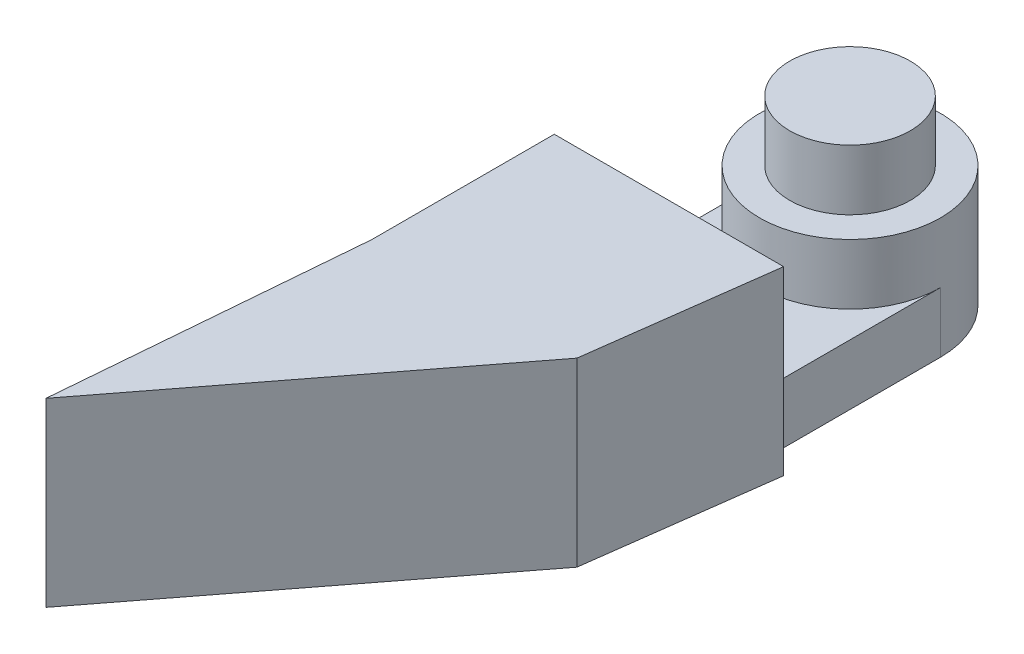
ISO-10303-21;
HEADER;
FILE_DESCRIPTION(('STEP AP214'),'2;1');
FILE_NAME('part.step','',(''),(''),'','','');
FILE_SCHEMA(('AUTOMOTIVE_DESIGN { 1 0 10303 214 1 1 1 1 }'));
ENDSEC;
DATA;
#1=APPLICATION_CONTEXT('core data for automotive mechanical design processes');
#2=APPLICATION_PROTOCOL_DEFINITION('international standard','automotive_design',2000,#1);
#3=PRODUCT_CONTEXT('',#1,'mechanical');
#4=PRODUCT('Part','Part','',(#3));
#5=PRODUCT_RELATED_PRODUCT_CATEGORY('part','',(#4));
#6=PRODUCT_DEFINITION_FORMATION('','',#4);
#7=PRODUCT_DEFINITION_CONTEXT('part definition',#1,'design');
#8=PRODUCT_DEFINITION('design','',#6,#7);
#9=PRODUCT_DEFINITION_SHAPE('','',#8);
#10=(LENGTH_UNIT() NAMED_UNIT(*) SI_UNIT(.MILLI.,.METRE.));
#11=(NAMED_UNIT(*) PLANE_ANGLE_UNIT() SI_UNIT($,.RADIAN.));
#12=(NAMED_UNIT(*) SI_UNIT($,.STERADIAN.) SOLID_ANGLE_UNIT());
#13=UNCERTAINTY_MEASURE_WITH_UNIT(LENGTH_MEASURE(1.E-05),#10,'distance_accuracy_value','');
#14=(GEOMETRIC_REPRESENTATION_CONTEXT(3) GLOBAL_UNCERTAINTY_ASSIGNED_CONTEXT((#13)) GLOBAL_UNIT_ASSIGNED_CONTEXT((#10,
#11,#12)) REPRESENTATION_CONTEXT('',''));
#15=CARTESIAN_POINT('',(0.,0.,0.));
#16=DIRECTION('',(0.,0.,1.));
#17=DIRECTION('',(1.,0.,0.));
#18=AXIS2_PLACEMENT_3D('',#15,#16,#17);
#19=CARTESIAN_POINT('',(98.9290186333893,15.,0.));
#20=DIRECTION('',(0.,-1.,0.));
#21=DIRECTION('',(0.,0.,-1.));
#22=AXIS2_PLACEMENT_3D('',#19,#20,#21);
#23=CYLINDRICAL_SURFACE('',#22,5.);
#24=CARTESIAN_POINT('',(98.9290186333893,10.,0.));
#25=DIRECTION('',(0.,1.,0.));
#26=DIRECTION('',(0.,0.,1.));
#27=AXIS2_PLACEMENT_3D('',#24,#25,#26);
#28=CIRCLE('',#27,5.);
#29=CARTESIAN_POINT('',(98.9290186333893,10.,5.));
#30=VERTEX_POINT('',#29);
#31=EDGE_CURVE('E11',#30,#30,#28,.F.);
#32=ORIENTED_EDGE('',*,*,#31,.F.);
#33=EDGE_LOOP('',(#32));
#34=FACE_BOUND('',#33,.T.);
#35=CARTESIAN_POINT('',(98.9290186333893,15.,0.));
#36=DIRECTION('',(0.,1.,0.));
#37=DIRECTION('',(0.,0.,1.));
#38=AXIS2_PLACEMENT_3D('',#35,#36,#37);
#39=CIRCLE('',#38,5.);
#40=CARTESIAN_POINT('',(98.9290186333893,15.,5.));
#41=VERTEX_POINT('',#40);
#42=EDGE_CURVE('E42',#41,#41,#39,.F.);
#43=ORIENTED_EDGE('',*,*,#42,.T.);
#44=EDGE_LOOP('',(#43));
#45=FACE_BOUND('',#44,.T.);
#46=ADVANCED_FACE('F35',(#34,#45),#23,.T.);
#47=CARTESIAN_POINT('',(0.,15.,0.));
#48=DIRECTION('',(0.,1.,0.));
#49=DIRECTION('',(0.,0.,1.));
#50=AXIS2_PLACEMENT_3D('',#47,#48,#49);
#51=PLANE('',#50);
#52=ORIENTED_EDGE('',*,*,#42,.F.);
#53=EDGE_LOOP('',(#52));
#54=FACE_BOUND('',#53,.T.);
#55=ADVANCED_FACE('F190',(#54),#51,.T.);
#56=CARTESIAN_POINT('',(98.9290186333893,10.,0.));
#57=DIRECTION('',(0.,-1.,0.));
#58=DIRECTION('',(0.,0.,-1.));
#59=AXIS2_PLACEMENT_3D('',#56,#57,#58);
#60=CYLINDRICAL_SURFACE('',#59,7.5);
#61=DIRECTION('',(0.,-1.,0.));
#62=VECTOR('',#61,1.);
#63=CARTESIAN_POINT('',(106.429018633389,5.,0.));
#64=LINE('',#63,#62);
#65=CARTESIAN_POINT('',(106.429018633389,5.,0.));
#66=VERTEX_POINT('',#65);
#67=CARTESIAN_POINT('',(106.429018633389,0.,0.));
#68=VERTEX_POINT('',#67);
#69=EDGE_CURVE('E75',#66,#68,#64,.T.);
#70=ORIENTED_EDGE('',*,*,#69,.T.);
#71=CARTESIAN_POINT('',(98.9290186333893,0.,0.));
#72=DIRECTION('',(0.,1.,0.));
#73=DIRECTION('',(0.,0.,1.));
#74=AXIS2_PLACEMENT_3D('',#71,#72,#73);
#75=CIRCLE('',#74,7.5);
#76=CARTESIAN_POINT('',(91.4290186333893,0.,0.));
#77=VERTEX_POINT('',#76);
#78=EDGE_CURVE('E182',#77,#68,#75,.F.);
#79=ORIENTED_EDGE('',*,*,#78,.F.);
#80=DIRECTION('',(0.,-1.,0.));
#81=VECTOR('',#80,1.);
#82=CARTESIAN_POINT('',(91.4290186333893,5.,0.));
#83=LINE('',#82,#81);
#84=CARTESIAN_POINT('',(91.4290186333893,5.,0.));
#85=VERTEX_POINT('',#84);
#86=EDGE_CURVE('E179',#85,#77,#83,.T.);
#87=ORIENTED_EDGE('',*,*,#86,.F.);
#88=CARTESIAN_POINT('',(98.9290186333893,5.,0.));
#89=DIRECTION('',(0.,1.,0.));
#90=DIRECTION('',(0.,0.,1.));
#91=AXIS2_PLACEMENT_3D('',#88,#89,#90);
#92=CIRCLE('',#91,7.5);
#93=EDGE_CURVE('E166',#66,#85,#92,.F.);
#94=ORIENTED_EDGE('',*,*,#93,.F.);
#95=EDGE_LOOP('',(#70,#79,#87,#94));
#96=FACE_BOUND('',#95,.T.);
#97=CARTESIAN_POINT('',(98.9290186333893,10.,0.));
#98=DIRECTION('',(0.,1.,0.));
#99=DIRECTION('',(0.,0.,1.));
#100=AXIS2_PLACEMENT_3D('',#97,#98,#99);
#101=CIRCLE('',#100,7.5);
#102=CARTESIAN_POINT('',(98.9290186333893,10.,7.5));
#103=VERTEX_POINT('',#102);
#104=EDGE_CURVE('E183',#103,#103,#101,.F.);
#105=ORIENTED_EDGE('',*,*,#104,.T.);
#106=EDGE_LOOP('',(#105));
#107=FACE_BOUND('',#106,.T.);
#108=ADVANCED_FACE('F192',(#96,#107),#60,.T.);
#109=CARTESIAN_POINT('',(0.,10.,0.));
#110=DIRECTION('',(0.,1.,0.));
#111=DIRECTION('',(0.,0.,1.));
#112=AXIS2_PLACEMENT_3D('',#109,#110,#111);
#113=PLANE('',#112);
#114=ORIENTED_EDGE('',*,*,#31,.T.);
#115=EDGE_LOOP('',(#114));
#116=FACE_BOUND('',#115,.T.);
#117=ORIENTED_EDGE('',*,*,#104,.F.);
#118=EDGE_LOOP('',(#117));
#119=FACE_BOUND('',#118,.T.);
#120=ADVANCED_FACE('F198',(#116,#119),#113,.T.);
#121=CARTESIAN_POINT('',(0.,0.,0.));
#122=DIRECTION('',(0.,1.,0.));
#123=DIRECTION('',(0.,0.,1.));
#124=AXIS2_PLACEMENT_3D('',#121,#122,#123);
#125=PLANE('',#124);
#126=ORIENTED_EDGE('',*,*,#78,.T.);
#127=DIRECTION('',(0.,0.,1.));
#128=VECTOR('',#127,1.);
#129=CARTESIAN_POINT('',(106.429018633389,0.,0.));
#130=LINE('',#129,#128);
#131=CARTESIAN_POINT('',(106.429018633389,0.,15.));
#132=VERTEX_POINT('',#131);
#133=EDGE_CURVE('E122',#68,#132,#130,.T.);
#134=ORIENTED_EDGE('',*,*,#133,.T.);
#135=DIRECTION('',(1.,0.,0.));
#136=VECTOR('',#135,1.);
#137=CARTESIAN_POINT('',(0.,0.,15.));
#138=LINE('',#137,#136);
#139=CARTESIAN_POINT('',(108.429018633389,0.,15.));
#140=VERTEX_POINT('',#139);
#141=EDGE_CURVE('E148',#132,#140,#138,.T.);
#142=ORIENTED_EDGE('',*,*,#141,.T.);
#143=DIRECTION('',(-0.131071920752448,0.,0.991372862040445));
#144=VECTOR('',#143,1.);
#145=CARTESIAN_POINT('',(108.515341708194,0.,14.3470885813101));
#146=LINE('',#145,#144);
#147=CARTESIAN_POINT('',(106.429018633389,0.,30.1271585302061));
#148=VERTEX_POINT('',#147);
#149=EDGE_CURVE('E118',#140,#148,#146,.T.);
#150=ORIENTED_EDGE('',*,*,#149,.T.);
#151=DIRECTION('',(-0.609198044114665,0.,0.793018122773286));
#152=VECTOR('',#151,1.);
#153=CARTESIAN_POINT('',(81.4854246461835,0.,62.5972596246702));
#154=LINE('',#153,#152);
#155=CARTESIAN_POINT('',(87.3216540728135,0.,55.));
#156=VERTEX_POINT('',#155);
#157=EDGE_CURVE('E134',#148,#156,#154,.T.);
#158=ORIENTED_EDGE('',*,*,#157,.T.);
#159=DIRECTION('',(0.0844230553486425,0.,-0.996430001417862));
#160=VECTOR('',#159,1.);
#161=CARTESIAN_POINT('',(91.3259821990599,0.,7.73764182028789));
#162=LINE('',#161,#160);
#163=CARTESIAN_POINT('',(89.4290186333893,0.,30.1271585302061));
#164=VERTEX_POINT('',#163);
#165=EDGE_CURVE('E154',#156,#164,#162,.T.);
#166=ORIENTED_EDGE('',*,*,#165,.T.);
#167=DIRECTION('',(0.,0.,-1.));
#168=VECTOR('',#167,1.);
#169=CARTESIAN_POINT('',(89.4290186333893,0.,0.));
#170=LINE('',#169,#168);
#171=CARTESIAN_POINT('',(89.4290186333893,0.,15.));
#172=VERTEX_POINT('',#171);
#173=EDGE_CURVE('E151',#164,#172,#170,.T.);
#174=ORIENTED_EDGE('',*,*,#173,.T.);
#175=CARTESIAN_POINT('',(91.4290186333893,0.,15.));
#176=VERTEX_POINT('',#175);
#177=EDGE_CURVE('E149',#172,#176,#138,.T.);
#178=ORIENTED_EDGE('',*,*,#177,.T.);
#179=DIRECTION('',(0.,0.,1.));
#180=VECTOR('',#179,1.);
#181=CARTESIAN_POINT('',(91.4290186333893,0.,0.));
#182=LINE('',#181,#180);
#183=EDGE_CURVE('E49',#77,#176,#182,.T.);
#184=ORIENTED_EDGE('',*,*,#183,.F.);
#185=EDGE_LOOP('',(#126,#134,#142,#150,#158,#166,#174,#178,#184));
#186=FACE_BOUND('',#185,.T.);
#187=ADVANCED_FACE('F203',(#186),#125,.F.);
#188=CARTESIAN_POINT('',(106.429018633389,5.,0.));
#189=DIRECTION('',(1.,0.,0.));
#190=DIRECTION('',(0.,0.,-1.));
#191=AXIS2_PLACEMENT_3D('',#188,#189,#190);
#192=PLANE('',#191);
#193=ORIENTED_EDGE('',*,*,#133,.F.);
#194=ORIENTED_EDGE('',*,*,#69,.F.);
#195=DIRECTION('',(0.,0.,1.));
#196=VECTOR('',#195,1.);
#197=CARTESIAN_POINT('',(106.429018633389,5.,0.));
#198=LINE('',#197,#196);
#199=CARTESIAN_POINT('',(106.429018633389,5.,15.));
#200=VERTEX_POINT('',#199);
#201=EDGE_CURVE('E58',#66,#200,#198,.T.);
#202=ORIENTED_EDGE('',*,*,#201,.T.);
#203=DIRECTION('',(0.,-1.,0.));
#204=VECTOR('',#203,1.);
#205=CARTESIAN_POINT('',(106.429018633389,5.,15.));
#206=LINE('',#205,#204);
#207=EDGE_CURVE('E71',#200,#132,#206,.T.);
#208=ORIENTED_EDGE('',*,*,#207,.T.);
#209=EDGE_LOOP('',(#193,#194,#202,#208));
#210=FACE_BOUND('',#209,.T.);
#211=ADVANCED_FACE('F205',(#210),#192,.T.);
#212=CARTESIAN_POINT('',(91.4290186333893,5.,0.));
#213=DIRECTION('',(1.,0.,0.));
#214=DIRECTION('',(0.,0.,-1.));
#215=AXIS2_PLACEMENT_3D('',#212,#213,#214);
#216=PLANE('',#215);
#217=ORIENTED_EDGE('',*,*,#183,.T.);
#218=DIRECTION('',(0.,-1.,0.));
#219=VECTOR('',#218,1.);
#220=CARTESIAN_POINT('',(91.4290186333893,5.,15.));
#221=LINE('',#220,#219);
#222=CARTESIAN_POINT('',(91.4290186333893,5.,15.));
#223=VERTEX_POINT('',#222);
#224=EDGE_CURVE('E176',#223,#176,#221,.T.);
#225=ORIENTED_EDGE('',*,*,#224,.F.);
#226=DIRECTION('',(0.,0.,1.));
#227=VECTOR('',#226,1.);
#228=CARTESIAN_POINT('',(91.4290186333893,5.,0.));
#229=LINE('',#228,#227);
#230=EDGE_CURVE('E168',#85,#223,#229,.T.);
#231=ORIENTED_EDGE('',*,*,#230,.F.);
#232=ORIENTED_EDGE('',*,*,#86,.T.);
#233=EDGE_LOOP('',(#217,#225,#231,#232));
#234=FACE_BOUND('',#233,.T.);
#235=ADVANCED_FACE('F210',(#234),#216,.F.);
#236=CARTESIAN_POINT('',(0.,5.,0.));
#237=DIRECTION('',(0.,1.,0.));
#238=DIRECTION('',(0.,0.,1.));
#239=AXIS2_PLACEMENT_3D('',#236,#237,#238);
#240=PLANE('',#239);
#241=ORIENTED_EDGE('',*,*,#201,.F.);
#242=ORIENTED_EDGE('',*,*,#93,.T.);
#243=ORIENTED_EDGE('',*,*,#230,.T.);
#244=DIRECTION('',(-1.,0.,0.));
#245=VECTOR('',#244,1.);
#246=CARTESIAN_POINT('',(0.,5.,15.));
#247=LINE('',#246,#245);
#248=EDGE_CURVE('E170',#200,#223,#247,.T.);
#249=ORIENTED_EDGE('',*,*,#248,.F.);
#250=EDGE_LOOP('',(#241,#242,#243,#249));
#251=FACE_BOUND('',#250,.T.);
#252=ADVANCED_FACE('F219',(#251),#240,.T.);
#253=CARTESIAN_POINT('',(0.,15.,15.));
#254=DIRECTION('',(0.,0.,-1.));
#255=DIRECTION('',(-1.,0.,0.));
#256=AXIS2_PLACEMENT_3D('',#253,#254,#255);
#257=PLANE('',#256);
#258=ORIENTED_EDGE('',*,*,#207,.F.);
#259=ORIENTED_EDGE('',*,*,#248,.T.);
#260=ORIENTED_EDGE('',*,*,#224,.T.);
#261=ORIENTED_EDGE('',*,*,#177,.F.);
#262=DIRECTION('',(0.,-1.,0.));
#263=VECTOR('',#262,1.);
#264=CARTESIAN_POINT('',(89.4290186333893,15.,15.));
#265=LINE('',#264,#263);
#266=CARTESIAN_POINT('',(89.4290186333893,15.,15.));
#267=VERTEX_POINT('',#266);
#268=EDGE_CURVE('E123',#267,#172,#265,.T.);
#269=ORIENTED_EDGE('',*,*,#268,.F.);
#270=DIRECTION('',(1.,0.,0.));
#271=VECTOR('',#270,1.);
#272=CARTESIAN_POINT('',(0.,15.,15.));
#273=LINE('',#272,#271);
#274=CARTESIAN_POINT('',(108.429018633389,15.,15.));
#275=VERTEX_POINT('',#274);
#276=EDGE_CURVE('E129',#267,#275,#273,.T.);
#277=ORIENTED_EDGE('',*,*,#276,.T.);
#278=DIRECTION('',(0.,-1.,0.));
#279=VECTOR('',#278,1.);
#280=CARTESIAN_POINT('',(108.429018633389,15.,15.));
#281=LINE('',#280,#279);
#282=EDGE_CURVE('E112',#275,#140,#281,.T.);
#283=ORIENTED_EDGE('',*,*,#282,.T.);
#284=ORIENTED_EDGE('',*,*,#141,.F.);
#285=EDGE_LOOP('',(#258,#259,#260,#261,#269,#277,#283,#284));
#286=FACE_BOUND('',#285,.T.);
#287=ADVANCED_FACE('F136',(#286),#257,.T.);
#288=CARTESIAN_POINT('',(108.515341708194,15.,14.3470885813101));
#289=DIRECTION('',(0.991372862040445,0.,0.131071920752448));
#290=DIRECTION('',(0.131071920752448,0.,-0.991372862040445));
#291=AXIS2_PLACEMENT_3D('',#288,#289,#290);
#292=PLANE('',#291);
#293=ORIENTED_EDGE('',*,*,#149,.F.);
#294=ORIENTED_EDGE('',*,*,#282,.F.);
#295=DIRECTION('',(-0.131071920752448,0.,0.991372862040445));
#296=VECTOR('',#295,1.);
#297=CARTESIAN_POINT('',(108.515341708194,15.,14.3470885813101));
#298=LINE('',#297,#296);
#299=CARTESIAN_POINT('',(106.429018633389,15.,30.1271585302061));
#300=VERTEX_POINT('',#299);
#301=EDGE_CURVE('E115',#275,#300,#298,.T.);
#302=ORIENTED_EDGE('',*,*,#301,.T.);
#303=DIRECTION('',(0.,-1.,0.));
#304=VECTOR('',#303,1.);
#305=CARTESIAN_POINT('',(106.429018633389,15.,30.1271585302061));
#306=LINE('',#305,#304);
#307=EDGE_CURVE('E146',#300,#148,#306,.T.);
#308=ORIENTED_EDGE('',*,*,#307,.T.);
#309=EDGE_LOOP('',(#293,#294,#302,#308));
#310=FACE_BOUND('',#309,.T.);
#311=ADVANCED_FACE('F114',(#310),#292,.T.);
#312=CARTESIAN_POINT('',(89.4290186333893,15.,0.));
#313=DIRECTION('',(-1.,0.,0.));
#314=DIRECTION('',(0.,0.,1.));
#315=AXIS2_PLACEMENT_3D('',#312,#313,#314);
#316=PLANE('',#315);
#317=ORIENTED_EDGE('',*,*,#173,.F.);
#318=DIRECTION('',(0.,-1.,0.));
#319=VECTOR('',#318,1.);
#320=CARTESIAN_POINT('',(89.4290186333893,15.,30.1271585302061));
#321=LINE('',#320,#319);
#322=CARTESIAN_POINT('',(89.4290186333893,15.,30.1271585302061));
#323=VERTEX_POINT('',#322);
#324=EDGE_CURVE('E162',#323,#164,#321,.T.);
#325=ORIENTED_EDGE('',*,*,#324,.F.);
#326=DIRECTION('',(0.,0.,-1.));
#327=VECTOR('',#326,1.);
#328=CARTESIAN_POINT('',(89.4290186333893,15.,0.));
#329=LINE('',#328,#327);
#330=EDGE_CURVE('E138',#323,#267,#329,.T.);
#331=ORIENTED_EDGE('',*,*,#330,.T.);
#332=ORIENTED_EDGE('',*,*,#268,.T.);
#333=EDGE_LOOP('',(#317,#325,#331,#332));
#334=FACE_BOUND('',#333,.T.);
#335=ADVANCED_FACE('F230',(#334),#316,.T.);
#336=CARTESIAN_POINT('',(91.3259821990599,15.,7.73764182028789));
#337=DIRECTION('',(-0.996430001417862,0.,-0.0844230553486425));
#338=DIRECTION('',(-0.0844230553486425,0.,0.996430001417862));
#339=AXIS2_PLACEMENT_3D('',#336,#337,#338);
#340=PLANE('',#339);
#341=ORIENTED_EDGE('',*,*,#165,.F.);
#342=DIRECTION('',(0.,-1.,0.));
#343=VECTOR('',#342,1.);
#344=CARTESIAN_POINT('',(87.3216540728135,15.,55.));
#345=LINE('',#344,#343);
#346=CARTESIAN_POINT('',(87.3216540728135,15.,55.));
#347=VERTEX_POINT('',#346);
#348=EDGE_CURVE('E160',#347,#156,#345,.T.);
#349=ORIENTED_EDGE('',*,*,#348,.F.);
#350=DIRECTION('',(0.0844230553486425,0.,-0.996430001417862));
#351=VECTOR('',#350,1.);
#352=CARTESIAN_POINT('',(91.3259821990599,15.,7.73764182028789));
#353=LINE('',#352,#351);
#354=EDGE_CURVE('E140',#347,#323,#353,.T.);
#355=ORIENTED_EDGE('',*,*,#354,.T.);
#356=ORIENTED_EDGE('',*,*,#324,.T.);
#357=EDGE_LOOP('',(#341,#349,#355,#356));
#358=FACE_BOUND('',#357,.T.);
#359=ADVANCED_FACE('F227',(#358),#340,.T.);
#360=CARTESIAN_POINT('',(81.4854246461835,15.,62.5972596246702));
#361=DIRECTION('',(0.793018122773286,0.,0.609198044114665));
#362=DIRECTION('',(0.609198044114665,0.,-0.793018122773286));
#363=AXIS2_PLACEMENT_3D('',#360,#361,#362);
#364=PLANE('',#363);
#365=ORIENTED_EDGE('',*,*,#157,.F.);
#366=ORIENTED_EDGE('',*,*,#307,.F.);
#367=DIRECTION('',(-0.609198044114665,0.,0.793018122773286));
#368=VECTOR('',#367,1.);
#369=CARTESIAN_POINT('',(81.4854246461835,15.,62.5972596246702));
#370=LINE('',#369,#368);
#371=EDGE_CURVE('E133',#300,#347,#370,.T.);
#372=ORIENTED_EDGE('',*,*,#371,.T.);
#373=ORIENTED_EDGE('',*,*,#348,.T.);
#374=EDGE_LOOP('',(#365,#366,#372,#373));
#375=FACE_BOUND('',#374,.T.);
#376=ADVANCED_FACE('F224',(#375),#364,.T.);
#377=CARTESIAN_POINT('',(0.,15.,0.));
#378=DIRECTION('',(0.,1.,0.));
#379=DIRECTION('',(0.,0.,1.));
#380=AXIS2_PLACEMENT_3D('',#377,#378,#379);
#381=PLANE('',#380);
#382=ORIENTED_EDGE('',*,*,#301,.F.);
#383=ORIENTED_EDGE('',*,*,#276,.F.);
#384=ORIENTED_EDGE('',*,*,#330,.F.);
#385=ORIENTED_EDGE('',*,*,#354,.F.);
#386=ORIENTED_EDGE('',*,*,#371,.F.);
#387=EDGE_LOOP('',(#382,#383,#384,#385,#386));
#388=FACE_BOUND('',#387,.T.);
#389=ADVANCED_FACE('F127',(#388),#381,.T.);
#390=CLOSED_SHELL('',(#46,#55,#108,#120,#187,#211,#235,#252,#287,#311,#335,#359,#376,#389));
#391=MANIFOLD_SOLID_BREP('B2',#390);
#392=ADVANCED_BREP_SHAPE_REPRESENTATION('',(#18,#391),#14);
#393=SHAPE_DEFINITION_REPRESENTATION(#9,#392);
ENDSEC;
END-ISO-10303-21;
